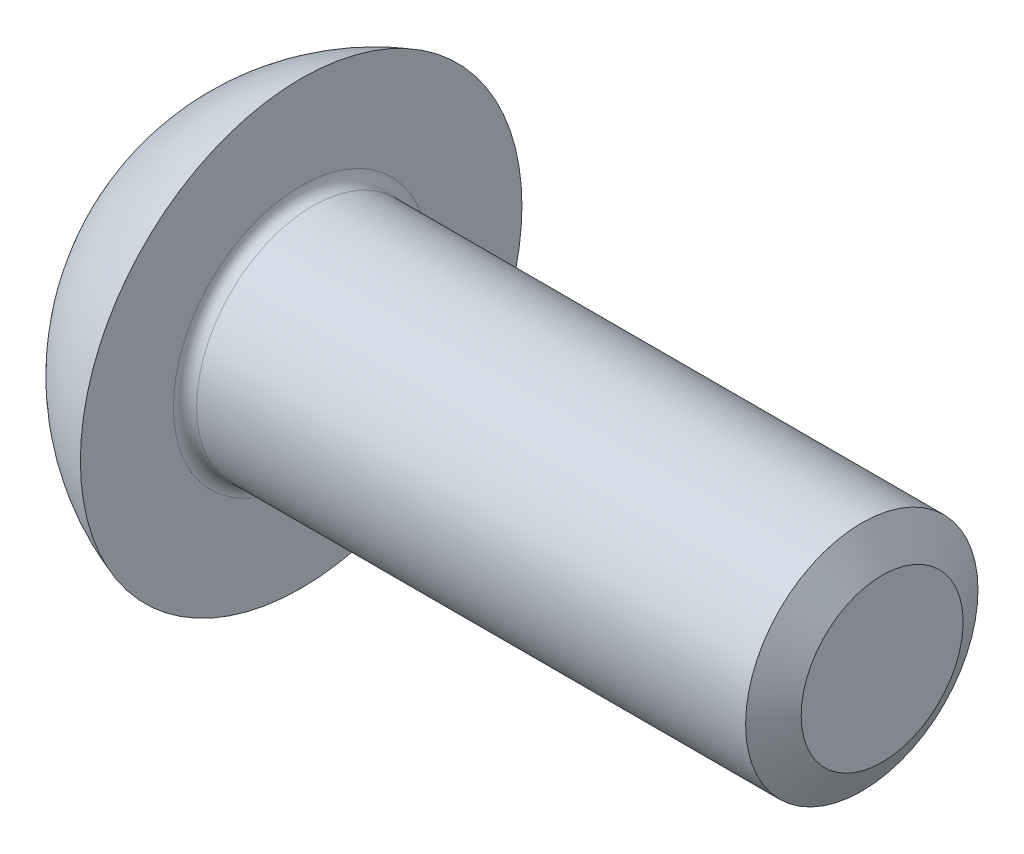
ISO-10303-21;
HEADER;
FILE_DESCRIPTION(('STEP AP214'),'2;1');
FILE_NAME('part.step','',(''),(''),'','','');
FILE_SCHEMA(('AUTOMOTIVE_DESIGN { 1 0 10303 214 1 1 1 1 }'));
ENDSEC;
DATA;
#1=APPLICATION_CONTEXT('core data for automotive mechanical design processes');
#2=APPLICATION_PROTOCOL_DEFINITION('international standard','automotive_design',2000,#1);
#3=PRODUCT_CONTEXT('',#1,'mechanical');
#4=PRODUCT('Part','Part','',(#3));
#5=PRODUCT_RELATED_PRODUCT_CATEGORY('part','',(#4));
#6=PRODUCT_DEFINITION_FORMATION('','',#4);
#7=PRODUCT_DEFINITION_CONTEXT('part definition',#1,'design');
#8=PRODUCT_DEFINITION('design','',#6,#7);
#9=PRODUCT_DEFINITION_SHAPE('','',#8);
#10=(LENGTH_UNIT() NAMED_UNIT(*) SI_UNIT(.MILLI.,.METRE.));
#11=(NAMED_UNIT(*) PLANE_ANGLE_UNIT() SI_UNIT($,.RADIAN.));
#12=(NAMED_UNIT(*) SI_UNIT($,.STERADIAN.) SOLID_ANGLE_UNIT());
#13=UNCERTAINTY_MEASURE_WITH_UNIT(LENGTH_MEASURE(1.E-05),#10,'distance_accuracy_value','');
#14=(GEOMETRIC_REPRESENTATION_CONTEXT(3) GLOBAL_UNCERTAINTY_ASSIGNED_CONTEXT((#13)) GLOBAL_UNIT_ASSIGNED_CONTEXT((#10,
#11,#12)) REPRESENTATION_CONTEXT('',''));
#15=CARTESIAN_POINT('',(0.,0.,0.));
#16=DIRECTION('',(0.,0.,1.));
#17=DIRECTION('',(1.,0.,0.));
#18=AXIS2_PLACEMENT_3D('',#15,#16,#17);
#19=CARTESIAN_POINT('',(-12.2,0.,0.));
#20=DIRECTION('',(-1.,0.,0.));
#21=DIRECTION('',(0.,0.,1.));
#22=AXIS2_PLACEMENT_3D('',#19,#20,#21);
#23=CYLINDRICAL_SURFACE('',#22,2.);
#24=CARTESIAN_POINT('',(-9.8,0.,0.));
#25=DIRECTION('',(-1.,0.,0.));
#26=DIRECTION('',(0.,0.,1.));
#27=AXIS2_PLACEMENT_3D('',#24,#25,#26);
#28=CIRCLE('',#27,2.);
#29=CARTESIAN_POINT('',(-9.8,0.,2.));
#30=VERTEX_POINT('',#29);
#31=EDGE_CURVE('E264',#30,#30,#28,.T.);
#32=ORIENTED_EDGE('',*,*,#31,.F.);
#33=EDGE_LOOP('',(#32));
#34=FACE_BOUND('',#33,.T.);
#35=CARTESIAN_POINT('',(-0.35,0.,0.));
#36=DIRECTION('',(-1.,0.,0.));
#37=DIRECTION('',(0.,0.,1.));
#38=AXIS2_PLACEMENT_3D('',#35,#36,#37);
#39=CIRCLE('',#38,2.);
#40=CARTESIAN_POINT('',(-0.35,0.,2.));
#41=VERTEX_POINT('',#40);
#42=EDGE_CURVE('E448',#41,#41,#39,.T.);
#43=ORIENTED_EDGE('',*,*,#42,.T.);
#44=EDGE_LOOP('',(#43));
#45=FACE_BOUND('',#44,.T.);
#46=ADVANCED_FACE('F42',(#34,#45),#23,.T.);
#47=CARTESIAN_POINT('',(-12.2,0.,0.));
#48=DIRECTION('',(1.,0.,0.));
#49=DIRECTION('',(0.,0.,-1.));
#50=AXIS2_PLACEMENT_3D('',#47,#48,#49);
#51=PLANE('',#50);
#52=CARTESIAN_POINT('',(-12.2,0.,0.));
#53=DIRECTION('',(-1.,0.,0.));
#54=DIRECTION('',(0.,0.,1.));
#55=AXIS2_PLACEMENT_3D('',#52,#53,#54);
#56=CIRCLE('',#55,2.);
#57=CARTESIAN_POINT('',(-12.2,2.,0.));
#58=VERTEX_POINT('',#57);
#59=EDGE_CURVE('E256',#58,#58,#56,.T.);
#60=ORIENTED_EDGE('',*,*,#59,.T.);
#61=EDGE_LOOP('',(#60));
#62=FACE_BOUND('',#61,.T.);
#63=CARTESIAN_POINT('',(-12.2,0.,0.));
#64=DIRECTION('',(1.,0.,0.));
#65=DIRECTION('',(0.,0.,-1.));
#66=AXIS2_PLACEMENT_3D('',#63,#64,#65);
#67=CIRCLE('',#66,1.44337567297406);
#68=CARTESIAN_POINT('',(-12.2,-0.721687836487032,-1.25));
#69=VERTEX_POINT('',#68);
#70=CARTESIAN_POINT('',(-12.2,-1.44337567297406,0.));
#71=VERTEX_POINT('',#70);
#72=EDGE_CURVE('E11',#69,#71,#67,.F.);
#73=ORIENTED_EDGE('',*,*,#72,.F.);
#74=CARTESIAN_POINT('',(-12.2,0.721687836487032,-1.25));
#75=VERTEX_POINT('',#74);
#76=EDGE_CURVE('E46',#75,#69,#67,.F.);
#77=ORIENTED_EDGE('',*,*,#76,.F.);
#78=CARTESIAN_POINT('',(-12.2,1.44337567297406,0.));
#79=VERTEX_POINT('',#78);
#80=EDGE_CURVE('E115',#79,#75,#67,.F.);
#81=ORIENTED_EDGE('',*,*,#80,.F.);
#82=CARTESIAN_POINT('',(-12.2,0.721687836487032,1.25));
#83=VERTEX_POINT('',#82);
#84=EDGE_CURVE('E329',#83,#79,#67,.F.);
#85=ORIENTED_EDGE('',*,*,#84,.F.);
#86=CARTESIAN_POINT('',(-12.2,-0.721687836487031,1.25));
#87=VERTEX_POINT('',#86);
#88=EDGE_CURVE('E51',#87,#83,#67,.F.);
#89=ORIENTED_EDGE('',*,*,#88,.F.);
#90=CARTESIAN_POINT('',(-12.2,0.,0.));
#91=DIRECTION('',(-1.,0.,0.));
#92=DIRECTION('',(0.,-1.,0.));
#93=AXIS2_PLACEMENT_3D('',#90,#91,#92);
#94=CIRCLE('',#93,1.44337567297406);
#95=EDGE_CURVE('E118',#71,#87,#94,.T.);
#96=ORIENTED_EDGE('',*,*,#95,.F.);
#97=EDGE_LOOP('',(#73,#77,#81,#85,#89,#96));
#98=FACE_BOUND('',#97,.T.);
#99=ADVANCED_FACE('F44',(#62,#98),#51,.F.);
#100=CARTESIAN_POINT('',(-8.72727272727273,0.,0.));
#101=DIRECTION('',(-1.,0.,0.));
#102=DIRECTION('',(0.,1.,0.));
#103=AXIS2_PLACEMENT_3D('',#100,#101,#102);
#104=SPHERICAL_SURFACE('',#103,4.00747235932374);
#105=CARTESIAN_POINT('',(-10.,0.,0.));
#106=DIRECTION('',(-1.,0.,0.));
#107=DIRECTION('',(0.,0.,1.));
#108=AXIS2_PLACEMENT_3D('',#105,#106,#107);
#109=CIRCLE('',#108,3.8);
#110=CARTESIAN_POINT('',(-10.,3.8,0.));
#111=VERTEX_POINT('',#110);
#112=EDGE_CURVE('E259',#111,#111,#109,.T.);
#113=CARTESIAN_POINT('',(-12.2,2.,0.));
#114=CARTESIAN_POINT('',(-12.1848940441993,2.0262295590073,0.));
#115=CARTESIAN_POINT('',(-12.1694908144314,2.05228791024858,0.));
#116=CARTESIAN_POINT('',(-12.1380979525594,2.10404896261472,0.));
#117=CARTESIAN_POINT('',(-12.1221083204554,2.12975166373958,0.));
#118=CARTESIAN_POINT('',(-12.0895507995097,2.18078818128854,0.));
#119=CARTESIAN_POINT('',(-12.072982910668,2.20612199771262,0.));
#120=CARTESIAN_POINT('',(-12.0392773993975,2.25640774959029,0.));
#121=CARTESIAN_POINT('',(-12.0221397769687,2.28135968504386,0.));
#122=CARTESIAN_POINT('',(-11.9873035925655,2.33086886166223,0.));
#123=CARTESIAN_POINT('',(-11.9696050305911,2.35542610282703,0.));
#124=CARTESIAN_POINT('',(-11.9336560549214,2.40413328370188,0.));
#125=CARTESIAN_POINT('',(-11.9154056412261,2.42828322341193,0.));
#126=CARTESIAN_POINT('',(-11.8783623317131,2.47616340238235,0.));
#127=CARTESIAN_POINT('',(-11.8595694358953,2.49989364164271,0.));
#128=CARTESIAN_POINT('',(-11.8214508106667,2.54692223644896,0.));
#129=CARTESIAN_POINT('',(-11.8021250812559,2.57022059199485,0.));
#130=CARTESIAN_POINT('',(-11.7629507108208,2.61637345777279,0.));
#131=CARTESIAN_POINT('',(-11.7431020697966,2.63922796800483,0.));
#132=CARTESIAN_POINT('',(-11.7028920666117,2.68448140944799,0.));
#133=CARTESIAN_POINT('',(-11.682530704451,2.70688034065911,0.));
#134=CARTESIAN_POINT('',(-11.6413057126977,2.75121112424681,0.));
#135=CARTESIAN_POINT('',(-11.6204420831052,2.77314297662341,0.));
#136=CARTESIAN_POINT('',(-11.5782232680636,2.81652834253228,0.));
#137=CARTESIAN_POINT('',(-11.5568680826145,2.83798185606455,0.));
#138=CARTESIAN_POINT('',(-11.5136771198039,2.88039952985806,0.));
#139=CARTESIAN_POINT('',(-11.4918413424423,2.90136369011931,0.));
#140=CARTESIAN_POINT('',(-11.447700406491,2.94279189418253,0.));
#141=CARTESIAN_POINT('',(-11.4253952479013,2.96325593798452,0.));
#142=CARTESIAN_POINT('',(-11.3803270011625,3.00367340270524,0.));
#143=CARTESIAN_POINT('',(-11.3575639130134,3.02362682362398,0.));
#144=CARTESIAN_POINT('',(-11.3115914939299,3.06301279831263,0.));
#145=CARTESIAN_POINT('',(-11.2883821629955,3.08244535208254,0.));
#146=CARTESIAN_POINT('',(-11.2415291742204,3.12077961562579,0.));
#147=CARTESIAN_POINT('',(-11.2178855163797,3.13968132539914,0.));
#148=CARTESIAN_POINT('',(-11.1701760126585,3.17694419664163,0.));
#149=CARTESIAN_POINT('',(-11.1461101667779,3.19530535811077,0.));
#150=CARTESIAN_POINT('',(-11.0975686425984,3.23147770595957,0.));
#151=CARTESIAN_POINT('',(-11.0730929642995,3.24928889233922,0.));
#152=CARTESIAN_POINT('',(-11.0237443413165,3.2843521455859,0.));
#153=CARTESIAN_POINT('',(-10.9988713966324,3.30160421245294,0.));
#154=CARTESIAN_POINT('',(-10.9487410108723,3.3355403693082,0.));
#155=CARTESIAN_POINT('',(-10.9234835697963,3.35222445929642,0.));
#156=CARTESIAN_POINT('',(-10.8725971586496,3.38501609663248,0.));
#157=CARTESIAN_POINT('',(-10.846968188579,3.40112364398032,0.));
#158=CARTESIAN_POINT('',(-10.7953518775865,3.43275392627554,0.));
#159=CARTESIAN_POINT('',(-10.7693645366645,3.44827666122294,0.));
#160=CARTESIAN_POINT('',(-10.7170448261044,3.47872934920754,0.));
#161=CARTESIAN_POINT('',(-10.6907124564662,3.49365930224475,0.));
#162=CARTESIAN_POINT('',(-10.6377162077463,3.52291876123,0.));
#163=CARTESIAN_POINT('',(-10.6110523286645,3.53724826717803,0.));
#164=CARTESIAN_POINT('',(-10.5574067505418,3.56529947511373,0.));
#165=CARTESIAN_POINT('',(-10.5304250515009,3.57902117710138,0.));
#166=CARTESIAN_POINT('',(-10.4761576860719,3.60584973217452,0.));
#167=CARTESIAN_POINT('',(-10.4488720196837,3.61895658526,0.));
#168=CARTESIAN_POINT('',(-10.3940107283966,3.6445487137135,0.));
#169=CARTESIAN_POINT('',(-10.3664351034975,3.65703398908152,0.));
#170=CARTESIAN_POINT('',(-10.3110080522769,3.6813765507008,0.));
#171=CARTESIAN_POINT('',(-10.2831566259553,3.69323383695206,0.));
#172=CARTESIAN_POINT('',(-10.2271922728732,3.71631433772655,0.));
#173=CARTESIAN_POINT('',(-10.1990793461126,3.72753755224977,0.));
#174=CARTESIAN_POINT('',(-10.1426064188229,3.74934412871163,0.));
#175=CARTESIAN_POINT('',(-10.1142464182938,3.75992749065027,0.));
#176=CARTESIAN_POINT('',(-10.0572939289701,3.78044899835327,0.));
#177=CARTESIAN_POINT('',(-10.0287014401756,3.79038714411763,0.));
#178=CARTESIAN_POINT('',(-10.,3.8,0.));
#179=B_SPLINE_CURVE_WITH_KNOTS('',3,(#113,#114,#115,#116,#117,#118,#119,#120,#121,#122,#123,
#124,#125,#126,#127,#128,#129,#130,#131,#132,#133,#134,#135,#136,#137,#138,#139,#140,#141,#142,
#143,#144,#145,#146,#147,#148,#149,#150,#151,#152,#153,#154,#155,#156,#157,#158,#159,#160,#161,
#162,#163,#164,#165,#166,#167,#168,#169,#170,#171,#172,#173,#174,#175,#176,#177,#178),
.UNSPECIFIED.,.F.,.F.,(4,2,2,2,2,2,2,2,2,2,2,2,2,2,2,2,2,2,2,2,2,2,2,2,2,2,2,2,2,2,2,2,4),(0.,
0.0908034330338798,0.18160686606776,0.272410299101639,0.363213732135517,0.454017165169397,
0.544820598203277,0.635624031237157,0.726427464271036,0.817230897304916,0.908034330338795,
0.998837763372675,1.08964119640655,1.18044462944043,1.27124806247431,1.36205149550819,
1.45285492854207,1.54365836157595,1.63446179460983,1.72526522764371,1.81606866067759,
1.90687209371147,1.99767552674535,2.08847895977923,2.17928239281311,2.27008582584699,
2.36088925888087,2.45169269191475,2.54249612494863,2.63329955798251,2.72410299101639,
2.81490642405026,2.90570985708414),.UNSPECIFIED.);
#180=EDGE_CURVE('BSEAM244',#58,#111,#179,.T.);
#181=ORIENTED_EDGE('',*,*,#59,.F.);
#182=ORIENTED_EDGE('',*,*,#112,.T.);
#183=ORIENTED_EDGE('',*,*,#180,.T.);
#184=ORIENTED_EDGE('',*,*,#180,.F.);
#185=EDGE_LOOP('',(#181,#183,#182,#184));
#186=FACE_BOUND('',#185,.T.);
#187=ADVANCED_FACE('F244',(#186),#104,.T.);
#188=CARTESIAN_POINT('',(-10.,2.2,0.));
#189=DIRECTION('',(-1.,0.,0.));
#190=DIRECTION('',(0.,0.,1.));
#191=AXIS2_PLACEMENT_3D('',#188,#189,#190);
#192=PLANE('',#191);
#193=ORIENTED_EDGE('',*,*,#112,.F.);
#194=EDGE_LOOP('',(#193));
#195=FACE_BOUND('',#194,.T.);
#196=CARTESIAN_POINT('',(-10.,0.,0.));
#197=DIRECTION('',(-1.,0.,0.));
#198=DIRECTION('',(0.,0.,1.));
#199=AXIS2_PLACEMENT_3D('',#196,#197,#198);
#200=CIRCLE('',#199,2.2);
#201=CARTESIAN_POINT('',(-10.,0.,2.2));
#202=VERTEX_POINT('',#201);
#203=EDGE_CURVE('E260',#202,#202,#200,.T.);
#204=ORIENTED_EDGE('',*,*,#203,.T.);
#205=EDGE_LOOP('',(#204));
#206=FACE_BOUND('',#205,.T.);
#207=ADVANCED_FACE('F241',(#195,#206),#192,.F.);
#208=CARTESIAN_POINT('',(-9.8,0.,0.));
#209=DIRECTION('',(-1.,0.,0.));
#210=DIRECTION('',(0.,0.,1.));
#211=AXIS2_PLACEMENT_3D('',#208,#209,#210);
#212=TOROIDAL_SURFACE('',#211,2.2,0.200000000000001);
#213=ORIENTED_EDGE('',*,*,#203,.F.);
#214=EDGE_LOOP('',(#213));
#215=FACE_BOUND('',#214,.T.);
#216=ORIENTED_EDGE('',*,*,#31,.T.);
#217=EDGE_LOOP('',(#216));
#218=FACE_BOUND('',#217,.T.);
#219=ADVANCED_FACE('F238',(#215,#218),#212,.F.);
#220=CARTESIAN_POINT('',(-11.83,0.,0.));
#221=DIRECTION('',(-1.,0.,0.));
#222=DIRECTION('',(0.,-1.,0.));
#223=AXIS2_PLACEMENT_3D('',#220,#221,#222);
#224=CONICAL_SURFACE('',#223,0.,1.31985626102756);
#225=CARTESIAN_POINT('',(-12.4099346759325,-1.885644561076,-1.25));
#226=CARTESIAN_POINT('',(-12.3978717207476,-1.8291770874165,-1.25));
#227=CARTESIAN_POINT('',(-12.3859628503841,-1.7726766725723,-1.25));
#228=CARTESIAN_POINT('',(-12.3625309817374,-1.65959353753871,-1.25));
#229=CARTESIAN_POINT('',(-12.3510079994509,-1.60301081403847,-1.25));
#230=CARTESIAN_POINT('',(-12.3171150455956,-1.43301680255399,-1.25));
#231=CARTESIAN_POINT('',(-12.2954436732229,-1.31946408423816,-1.25));
#232=CARTESIAN_POINT('',(-12.2550957638519,-1.09274070822473,-1.25));
#233=CARTESIAN_POINT('',(-12.2363969731627,-0.97957409090879,-1.25));
#234=CARTESIAN_POINT('',(-12.2032623365578,-0.752620098767597,-1.25));
#235=CARTESIAN_POINT('',(-12.188825705465,-0.638832842215426,-1.25));
#236=CARTESIAN_POINT('',(-12.1660896767959,-0.409425109570646,-1.25));
#237=CARTESIAN_POINT('',(-12.1578544497063,-0.293797778292055,-1.25));
#238=CARTESIAN_POINT('',(-12.1515679025376,-0.12016451287169,-1.25));
#239=CARTESIAN_POINT('',(-12.150483164521,-0.0622627928697091,-1.25));
#240=CARTESIAN_POINT('',(-12.1503795328621,0.0535425643634299,-1.25));
#241=CARTESIAN_POINT('',(-12.1513606413601,0.111446201596512,-1.25));
#242=CARTESIAN_POINT('',(-12.1573598650309,0.28547429561123,-1.25));
#243=CARTESIAN_POINT('',(-12.1654487463646,0.401498867331898,-1.25));
#244=CARTESIAN_POINT('',(-12.1881044285101,0.632939913567424,-1.25));
#245=CARTESIAN_POINT('',(-12.2026754362751,0.748355943831217,-1.25));
#246=CARTESIAN_POINT('',(-12.2365518645336,0.980878548339567,-1.25));
#247=CARTESIAN_POINT('',(-12.2559479393881,1.09797147869704,-1.25));
#248=CARTESIAN_POINT('',(-12.297694705209,1.33163516353436,-1.25));
#249=CARTESIAN_POINT('',(-12.3200458280349,1.44820583911092,-1.25));
#250=CARTESIAN_POINT('',(-12.3666691464558,1.68099121637416,-1.25));
#251=CARTESIAN_POINT('',(-12.3909418646374,1.79720581223611,-1.25));
#252=CARTESIAN_POINT('',(-12.4407644332086,2.02936144854685,-1.25));
#253=CARTESIAN_POINT('',(-12.4663143094331,2.14530248341221,-1.25));
#254=CARTESIAN_POINT('',(-12.518006571917,2.37571314631909,-1.25));
#255=CARTESIAN_POINT('',(-12.5441393559518,2.49018493743663,-1.25));
#256=CARTESIAN_POINT('',(-12.5970181249123,2.71898894131966,-1.25));
#257=CARTESIAN_POINT('',(-12.6237641225282,2.83332115114489,-1.25));
#258=CARTESIAN_POINT('',(-12.6776683130688,3.06173187864781,-1.25));
#259=CARTESIAN_POINT('',(-12.7048259274931,3.17581053313172,-1.25));
#260=CARTESIAN_POINT('',(-12.7594820608418,3.40388218743046,-1.25));
#261=CARTESIAN_POINT('',(-12.7869805683896,3.51787518996983,-1.25));
#262=CARTESIAN_POINT('',(-12.8145979060137,3.63183906574753,-1.25));
#263=B_SPLINE_CURVE_WITH_KNOTS('',3,(#225,#226,#227,#228,#229,#230,#231,#232,#233,#234,#235,
#236,#237,#238,#239,#240,#241,#242,#243,#244,#245,#246,#247,#248,#249,#250,#251,#252,#253,#254,
#255,#256,#257,#258,#259,#260,#261,#262),.UNSPECIFIED.,.F.,.F.,(4,2,2,2,2,2,2,2,2,2,2,2,2,2,2,2,
2,2,4),(0.,0.173224298995285,0.346455770019722,0.693239171189212,1.03728991141696,
1.38127723083866,1.72877689604067,1.90247833739644,2.07617995870963,2.42483219738436,
2.77371104508349,3.12971850144866,3.48577804345035,3.84193475233927,4.19809866864178,
4.55034691705482,4.90260246171338,5.25440194240088,5.60618971383707),.UNSPECIFIED.);
#264=EDGE_CURVE('E106',#69,#75,#263,.T.);
#265=ORIENTED_EDGE('',*,*,#264,.T.);
#266=ORIENTED_EDGE('',*,*,#76,.T.);
#267=EDGE_LOOP('',(#265,#266));
#268=FACE_BOUND('',#267,.T.);
#269=ADVANCED_FACE('F110',(#268),#224,.F.);
#270=CARTESIAN_POINT('',(-12.2000296035517,0.721572366433194,-1.2502));
#271=CARTESIAN_POINT('',(-12.1923376245114,0.751560236122211,-1.19825948608787));
#272=CARTESIAN_POINT('',(-12.1853558988612,0.781597955311093,-1.14623263030924));
#273=CARTESIAN_POINT('',(-12.1730912390252,0.841770545746215,-1.04201064645257));
#274=CARTESIAN_POINT('',(-12.1678089341386,0.871905448817342,-0.989815463252219));
#275=CARTESIAN_POINT('',(-12.1592477971586,0.932104975245319,-0.885546824887377));
#276=CARTESIAN_POINT('',(-12.1559596086559,0.96216925702196,-0.833473961357168));
#277=CARTESIAN_POINT('',(-12.1515506008694,1.0223329488635,-0.729267390316703));
#278=CARTESIAN_POINT('',(-12.1504293994002,1.05243235179702,-0.677133695158352));
#279=CARTESIAN_POINT('',(-12.1504293994002,1.11263115766407,-0.572866304841649));
#280=CARTESIAN_POINT('',(-12.1515506008694,1.1427305605976,-0.520732609683297));
#281=CARTESIAN_POINT('',(-12.1559596086559,1.20289425243914,-0.416526038642832));
#282=CARTESIAN_POINT('',(-12.1592477971586,1.23295853421578,-0.364453175112624));
#283=CARTESIAN_POINT('',(-12.1678089341386,1.29315806064375,-0.260184536747781));
#284=CARTESIAN_POINT('',(-12.1730912390252,1.32329296371488,-0.207989353547427));
#285=CARTESIAN_POINT('',(-12.1853558988612,1.38346555415,-0.103767369690763));
#286=CARTESIAN_POINT('',(-12.1923376245114,1.41350327333889,-0.0517405139121316));
#287=CARTESIAN_POINT('',(-12.2000296035517,1.4434911430279,0.000199999999999756));
#288=B_SPLINE_CURVE_WITH_KNOTS('',3,(#270,#271,#272,#273,#274,#275,#276,#277,#278,#279,#280,
#281,#282,#283,#284,#285,#286,#287),.UNSPECIFIED.,.F.,.F.,(4,2,2,2,2,2,2,2,4),(0.,
0.181409592460798,0.362886284169927,0.543504761741732,0.724091381228726,0.904678000715721,
1.08529647828753,1.26677316999666,1.44818276245745),.UNSPECIFIED.);
#289=EDGE_CURVE('E134',#75,#79,#288,.T.);
#290=ORIENTED_EDGE('',*,*,#289,.T.);
#291=ORIENTED_EDGE('',*,*,#80,.T.);
#292=EDGE_LOOP('',(#290,#291));
#293=FACE_BOUND('',#292,.T.);
#294=ADVANCED_FACE('F162',(#293),#224,.F.);
#295=CARTESIAN_POINT('',(-12.2000296035517,1.4434911430279,-0.000200000000000031));
#296=CARTESIAN_POINT('',(-12.1923376245114,1.41350327333889,0.0517405139121313));
#297=CARTESIAN_POINT('',(-12.1853558988612,1.38346555415,0.103767369690762));
#298=CARTESIAN_POINT('',(-12.1730912390252,1.32329296371488,0.207989353547427));
#299=CARTESIAN_POINT('',(-12.1678089341386,1.29315806064375,0.260184536747781));
#300=CARTESIAN_POINT('',(-12.1592477971586,1.23295853421578,0.364453175112623));
#301=CARTESIAN_POINT('',(-12.1559596086559,1.20289425243914,0.416526038642832));
#302=CARTESIAN_POINT('',(-12.1515506008694,1.1427305605976,0.520732609683297));
#303=CARTESIAN_POINT('',(-12.1504293994002,1.11263115766407,0.572866304841648));
#304=CARTESIAN_POINT('',(-12.1504293994002,1.05243235179702,0.677133695158351));
#305=CARTESIAN_POINT('',(-12.1515506008694,1.0223329488635,0.729267390316703));
#306=CARTESIAN_POINT('',(-12.1559596086559,0.96216925702196,0.833473961357168));
#307=CARTESIAN_POINT('',(-12.1592477971586,0.93210497524532,0.885546824887376));
#308=CARTESIAN_POINT('',(-12.1678089341386,0.871905448817342,0.989815463252219));
#309=CARTESIAN_POINT('',(-12.1730912390252,0.841770545746216,1.04201064645257));
#310=CARTESIAN_POINT('',(-12.1853558988612,0.781597955311094,1.14623263030924));
#311=CARTESIAN_POINT('',(-12.1923376245114,0.751560236122211,1.19825948608787));
#312=CARTESIAN_POINT('',(-12.2000296035517,0.721572366433195,1.2502));
#313=B_SPLINE_CURVE_WITH_KNOTS('',3,(#295,#296,#297,#298,#299,#300,#301,#302,#303,#304,#305,
#306,#307,#308,#309,#310,#311,#312),.UNSPECIFIED.,.F.,.F.,(4,2,2,2,2,2,2,2,4),(0.,
0.181409592460797,0.362886284169926,0.543504761741732,0.724091381228726,0.904678000715721,
1.08529647828753,1.26677316999665,1.44818276245745),.UNSPECIFIED.);
#314=EDGE_CURVE('E184',#79,#83,#313,.T.);
#315=ORIENTED_EDGE('',*,*,#314,.T.);
#316=ORIENTED_EDGE('',*,*,#84,.T.);
#317=EDGE_LOOP('',(#315,#316));
#318=FACE_BOUND('',#317,.T.);
#319=ADVANCED_FACE('F156',(#318),#224,.F.);
#320=CARTESIAN_POINT('',(-12.4099346759325,-1.885644561076,1.25));
#321=CARTESIAN_POINT('',(-12.3978717207476,-1.8291770874165,1.25));
#322=CARTESIAN_POINT('',(-12.3859628503841,-1.7726766725723,1.25));
#323=CARTESIAN_POINT('',(-12.3625309817374,-1.65959353753871,1.25));
#324=CARTESIAN_POINT('',(-12.3510079994509,-1.60301081403847,1.25));
#325=CARTESIAN_POINT('',(-12.3171150455956,-1.43301680255399,1.25));
#326=CARTESIAN_POINT('',(-12.2954436732229,-1.31946408423817,1.25));
#327=CARTESIAN_POINT('',(-12.2550957638519,-1.09274070822473,1.25));
#328=CARTESIAN_POINT('',(-12.2363969731627,-0.97957409090879,1.25));
#329=CARTESIAN_POINT('',(-12.2032623365578,-0.752620098767597,1.25));
#330=CARTESIAN_POINT('',(-12.188825705465,-0.638832842215426,1.25));
#331=CARTESIAN_POINT('',(-12.1660896767959,-0.409425109570646,1.25));
#332=CARTESIAN_POINT('',(-12.1578544497063,-0.293797778292056,1.25));
#333=CARTESIAN_POINT('',(-12.1515679025376,-0.120164512871691,1.25));
#334=CARTESIAN_POINT('',(-12.150483164521,-0.0622627928697096,1.25));
#335=CARTESIAN_POINT('',(-12.1503795328621,0.0535425643634294,1.25));
#336=CARTESIAN_POINT('',(-12.1513606413601,0.111446201596511,1.25));
#337=CARTESIAN_POINT('',(-12.1573598650309,0.285474295611229,1.25));
#338=CARTESIAN_POINT('',(-12.1654487463646,0.401498867331898,1.25));
#339=CARTESIAN_POINT('',(-12.1881044285101,0.632939913567424,1.25));
#340=CARTESIAN_POINT('',(-12.2026754362751,0.748355943831216,1.25));
#341=CARTESIAN_POINT('',(-12.2365518645336,0.980878548339567,1.25));
#342=CARTESIAN_POINT('',(-12.2559479393881,1.09797147869704,1.25));
#343=CARTESIAN_POINT('',(-12.297694705209,1.33163516353436,1.25));
#344=CARTESIAN_POINT('',(-12.3200458280349,1.44820583911092,1.25));
#345=CARTESIAN_POINT('',(-12.3666691464558,1.68099121637416,1.25));
#346=CARTESIAN_POINT('',(-12.3909418646374,1.79720581223611,1.25));
#347=CARTESIAN_POINT('',(-12.4407644332086,2.02936144854685,1.25));
#348=CARTESIAN_POINT('',(-12.4663143094331,2.14530248341221,1.25));
#349=CARTESIAN_POINT('',(-12.518006571917,2.37571314631909,1.25));
#350=CARTESIAN_POINT('',(-12.5441393559518,2.49018493743663,1.25));
#351=CARTESIAN_POINT('',(-12.5970181249123,2.71898894131966,1.25));
#352=CARTESIAN_POINT('',(-12.6237641225282,2.83332115114489,1.25));
#353=CARTESIAN_POINT('',(-12.6776683130688,3.06173187864781,1.25));
#354=CARTESIAN_POINT('',(-12.7048259274931,3.17581053313172,1.25));
#355=CARTESIAN_POINT('',(-12.7594820608418,3.40388218743046,1.25));
#356=CARTESIAN_POINT('',(-12.7869805683896,3.51787518996983,1.25));
#357=CARTESIAN_POINT('',(-12.8145979060137,3.63183906574753,1.25));
#358=B_SPLINE_CURVE_WITH_KNOTS('',3,(#320,#321,#322,#323,#324,#325,#326,#327,#328,#329,#330,
#331,#332,#333,#334,#335,#336,#337,#338,#339,#340,#341,#342,#343,#344,#345,#346,#347,#348,#349,
#350,#351,#352,#353,#354,#355,#356,#357),.UNSPECIFIED.,.F.,.F.,(4,2,2,2,2,2,2,2,2,2,2,2,2,2,2,2,
2,2,4),(0.,0.173224298995285,0.346455770019722,0.693239171189212,1.03728991141696,
1.38127723083866,1.72877689604067,1.90247833739644,2.07617995870963,2.42483219738436,
2.77371104508349,3.12971850144866,3.48577804345035,3.84193475233927,4.19809866864178,
4.55034691705482,4.90260246171338,5.25440194240088,5.60618971383707),.UNSPECIFIED.);
#359=EDGE_CURVE('E63',#83,#87,#358,.F.);
#360=ORIENTED_EDGE('',*,*,#359,.T.);
#361=ORIENTED_EDGE('',*,*,#88,.T.);
#362=EDGE_LOOP('',(#360,#361));
#363=FACE_BOUND('',#362,.T.);
#364=ADVANCED_FACE('F161',(#363),#224,.F.);
#365=CARTESIAN_POINT('',(-12.2000296035517,-0.721572366433195,1.2502));
#366=CARTESIAN_POINT('',(-12.1923376245114,-0.751560236122212,1.19825948608787));
#367=CARTESIAN_POINT('',(-12.1853558988612,-0.781597955311094,1.14623263030924));
#368=CARTESIAN_POINT('',(-12.1730912390252,-0.841770545746216,1.04201064645257));
#369=CARTESIAN_POINT('',(-12.1678089341386,-0.871905448817343,0.989815463252219));
#370=CARTESIAN_POINT('',(-12.1592477971586,-0.93210497524532,0.885546824887376));
#371=CARTESIAN_POINT('',(-12.1559596086559,-0.962169257021961,0.833473961357168));
#372=CARTESIAN_POINT('',(-12.1515506008694,-1.0223329488635,0.729267390316703));
#373=CARTESIAN_POINT('',(-12.1504293994002,-1.05243235179702,0.677133695158351));
#374=CARTESIAN_POINT('',(-12.1504293994002,-1.11263115766407,0.572866304841648));
#375=CARTESIAN_POINT('',(-12.1515506008694,-1.1427305605976,0.520732609683297));
#376=CARTESIAN_POINT('',(-12.1559596086559,-1.20289425243914,0.416526038642831));
#377=CARTESIAN_POINT('',(-12.1592477971586,-1.23295853421578,0.364453175112623));
#378=CARTESIAN_POINT('',(-12.1678089341386,-1.29315806064376,0.260184536747781));
#379=CARTESIAN_POINT('',(-12.1730912390252,-1.32329296371488,0.207989353547427));
#380=CARTESIAN_POINT('',(-12.1853558988612,-1.38346555415,0.103767369690762));
#381=CARTESIAN_POINT('',(-12.1923376245114,-1.41350327333889,0.0517405139121309));
#382=CARTESIAN_POINT('',(-12.2000296035517,-1.4434911430279,-0.000200000000000191));
#383=B_SPLINE_CURVE_WITH_KNOTS('',3,(#365,#366,#367,#368,#369,#370,#371,#372,#373,#374,#375,
#376,#377,#378,#379,#380,#381,#382),.UNSPECIFIED.,.F.,.F.,(4,2,2,2,2,2,2,2,4),(0.,
0.181409592460797,0.362886284169926,0.543504761741732,0.724091381228726,0.904678000715721,
1.08529647828753,1.26677316999666,1.44818276245745),.UNSPECIFIED.);
#384=EDGE_CURVE('E57',#87,#71,#383,.T.);
#385=ORIENTED_EDGE('',*,*,#384,.T.);
#386=ORIENTED_EDGE('',*,*,#95,.T.);
#387=EDGE_LOOP('',(#385,#386));
#388=FACE_BOUND('',#387,.T.);
#389=ADVANCED_FACE('F316',(#388),#224,.F.);
#390=CARTESIAN_POINT('',(-12.2000296035517,-1.4434911430279,0.000199999999999413));
#391=CARTESIAN_POINT('',(-12.1923376245114,-1.41350327333889,-0.0517405139121317));
#392=CARTESIAN_POINT('',(-12.1853558988612,-1.38346555415,-0.103767369690763));
#393=CARTESIAN_POINT('',(-12.1730912390252,-1.32329296371488,-0.207989353547427));
#394=CARTESIAN_POINT('',(-12.1678089341386,-1.29315806064376,-0.260184536747781));
#395=CARTESIAN_POINT('',(-12.1592477971586,-1.23295853421578,-0.364453175112624));
#396=CARTESIAN_POINT('',(-12.1559596086559,-1.20289425243914,-0.416526038642832));
#397=CARTESIAN_POINT('',(-12.1515506008694,-1.1427305605976,-0.520732609683297));
#398=CARTESIAN_POINT('',(-12.1504293994002,-1.11263115766407,-0.572866304841649));
#399=CARTESIAN_POINT('',(-12.1504293994002,-1.05243235179702,-0.677133695158352));
#400=CARTESIAN_POINT('',(-12.1515506008694,-1.0223329488635,-0.729267390316703));
#401=CARTESIAN_POINT('',(-12.1559596086559,-0.96216925702196,-0.833473961357168));
#402=CARTESIAN_POINT('',(-12.1592477971586,-0.93210497524532,-0.885546824887376));
#403=CARTESIAN_POINT('',(-12.1678089341386,-0.871905448817343,-0.989815463252219));
#404=CARTESIAN_POINT('',(-12.1730912390252,-0.841770545746216,-1.04201064645257));
#405=CARTESIAN_POINT('',(-12.1853558988612,-0.781597955311094,-1.14623263030924));
#406=CARTESIAN_POINT('',(-12.1923376245114,-0.751560236122212,-1.19825948608787));
#407=CARTESIAN_POINT('',(-12.2000296035517,-0.721572366433195,-1.2502));
#408=B_SPLINE_CURVE_WITH_KNOTS('',3,(#390,#391,#392,#393,#394,#395,#396,#397,#398,#399,#400,
#401,#402,#403,#404,#405,#406,#407),.UNSPECIFIED.,.F.,.F.,(4,2,2,2,2,2,2,2,4),(0.,
0.181409592460797,0.362886284169926,0.543504761741732,0.724091381228726,0.904678000715721,
1.08529647828753,1.26677316999665,1.44818276245745),.UNSPECIFIED.);
#409=EDGE_CURVE('E98',#71,#69,#408,.T.);
#410=ORIENTED_EDGE('',*,*,#409,.T.);
#411=ORIENTED_EDGE('',*,*,#72,.T.);
#412=EDGE_LOOP('',(#410,#411));
#413=FACE_BOUND('',#412,.T.);
#414=ADVANCED_FACE('F100',(#413),#224,.F.);
#415=CARTESIAN_POINT('',(-10.9,0.,0.));
#416=DIRECTION('',(-1.,0.,0.));
#417=DIRECTION('',(0.,0.,1.));
#418=AXIS2_PLACEMENT_3D('',#415,#416,#417);
#419=CONICAL_SURFACE('',#418,1.44337567297406,1.01324881882863);
#420=CARTESIAN_POINT('',(-10.,0.,0.));
#421=VERTEX_POINT('',#420);
#422=VERTEX_LOOP('',#421);
#423=FACE_BOUND('',#422,.T.);
#424=CARTESIAN_POINT('',(-11.3527945795421,-1.77325319370587,1.25));
#425=CARTESIAN_POINT('',(-11.3272313608337,-1.72308054748254,1.25));
#426=CARTESIAN_POINT('',(-11.3019425610441,-1.67276579739611,1.25));
#427=CARTESIAN_POINT('',(-11.2520602884769,-1.57178113050657,1.25));
#428=CARTESIAN_POINT('',(-11.2274669508561,-1.52111114702254,1.25));
#429=CARTESIAN_POINT('',(-11.1789832389279,-1.41905106562435,1.25));
#430=CARTESIAN_POINT('',(-11.1550981267071,-1.36765845463947,1.25));
#431=CARTESIAN_POINT('',(-11.1084115654386,-1.26438731533743,1.25));
#432=CARTESIAN_POINT('',(-11.0856100580289,-1.21250881337054,1.25));
#433=CARTESIAN_POINT('',(-11.0180066296141,-1.05318865262781,1.25));
#434=CARTESIAN_POINT('',(-10.975348048821,-0.944818595736523,1.25));
#435=CARTESIAN_POINT('',(-10.899249765014,-0.725021793662277,1.25));
#436=CARTESIAN_POINT('',(-10.8657864364544,-0.61360370625827,1.25));
#437=CARTESIAN_POINT('',(-10.8255224000706,-0.439829475428556,1.25));
#438=CARTESIAN_POINT('',(-10.8135539759356,-0.378686784718628,1.25));
#439=CARTESIAN_POINT('',(-10.7946834115852,-0.255611326700576,1.25));
#440=CARTESIAN_POINT('',(-10.7877804723348,-0.193678685568829,1.25));
#441=CARTESIAN_POINT('',(-10.7797277447971,-0.0702459018996856,1.25));
#442=CARTESIAN_POINT('',(-10.7785036595021,-0.00875074655362739,1.25));
#443=CARTESIAN_POINT('',(-10.7817252928589,0.114091468273713,1.25));
#444=CARTESIAN_POINT('',(-10.7861717520863,0.175438507362528,1.25));
#445=CARTESIAN_POINT('',(-10.802790821166,0.318793774562431,1.25));
#446=CARTESIAN_POINT('',(-10.8171162097553,0.40055050780021,1.25));
#447=CARTESIAN_POINT('',(-10.8533604743273,0.562357759535309,1.25));
#448=CARTESIAN_POINT('',(-10.8752859853004,0.642406722094853,1.25));
#449=CARTESIAN_POINT('',(-10.9252263796581,0.802612605575798,1.25));
#450=CARTESIAN_POINT('',(-10.9533725953862,0.88272761011228,1.25));
#451=CARTESIAN_POINT('',(-11.0137044102596,1.04136692759758,1.25));
#452=CARTESIAN_POINT('',(-11.0458888175979,1.11989170196819,1.25));
#453=CARTESIAN_POINT('',(-11.1085113010088,1.26504456834479,1.25));
#454=CARTESIAN_POINT('',(-11.1385863298607,1.33183108575291,1.25));
#455=CARTESIAN_POINT('',(-11.2003370421044,1.46466259424516,1.25));
#456=CARTESIAN_POINT('',(-11.2320128472902,1.53070752843773,1.25));
#457=CARTESIAN_POINT('',(-11.3288612944515,1.72800114412657,1.25));
#458=CARTESIAN_POINT('',(-11.3958346146514,1.85836304165699,1.25));
#459=CARTESIAN_POINT('',(-11.5327729293065,2.11775589592147,1.25));
#460=CARTESIAN_POINT('',(-11.6027425964556,2.24678435317969,1.25));
#461=CARTESIAN_POINT('',(-11.7445495255551,2.50377456749809,1.25));
#462=CARTESIAN_POINT('',(-11.8163864088467,2.63173653399053,1.25));
#463=CARTESIAN_POINT('',(-11.9535702802704,2.87326192040095,1.25));
#464=CARTESIAN_POINT('',(-12.0187879458601,2.98689907544955,1.25));
#465=CARTESIAN_POINT('',(-12.1499753350724,3.21374706697092,1.25));
#466=CARTESIAN_POINT('',(-12.2159451030052,3.32695787779727,1.25));
#467=CARTESIAN_POINT('',(-12.3482234067217,3.55267191020502,1.25));
#468=CARTESIAN_POINT('',(-12.4145300682268,3.66517623176316,1.25));
#469=CARTESIAN_POINT('',(-12.5475751113016,3.8899176768681,1.25));
#470=CARTESIAN_POINT('',(-12.6143134591135,4.00215482039119,1.25));
#471=CARTESIAN_POINT('',(-12.6812102093033,4.11429687203232,1.25));
#472=B_SPLINE_CURVE_WITH_KNOTS('',3,(#424,#425,#426,#427,#428,#429,#430,#431,#432,#433,#434,
#435,#436,#437,#438,#439,#440,#441,#442,#443,#444,#445,#446,#447,#448,#449,#450,#451,#452,#453,
#454,#455,#456,#457,#458,#459,#460,#461,#462,#463,#464,#465,#466,#467,#468,#469,#470,#471),
.UNSPECIFIED.,.F.,.F.,(4,2,2,2,2,2,2,2,2,2,2,2,2,2,2,2,2,2,2,2,2,2,2,4),(0.,0.16893088808668,
0.337894383813143,0.50789846348262,0.67789337646512,1.0270708628597,1.3753426286684,
1.5620783253289,1.74878455976038,1.93304107769939,2.11732166208064,2.36583389677495,
2.61456363408265,2.86915526427585,3.12367193182966,3.34338375168395,3.56311231342189,
4.00271912781841,4.44303841363043,4.88326909182565,5.27633168545271,5.66941755741553,
6.06118706475326,6.45292629749501),.UNSPECIFIED.);
#473=CARTESIAN_POINT('',(-10.9,-0.721687836487033,1.25));
#474=VERTEX_POINT('',#473);
#475=CARTESIAN_POINT('',(-10.9,0.721687836487032,1.25));
#476=VERTEX_POINT('',#475);
#477=EDGE_CURVE('E200',#474,#476,#472,.T.);
#478=ORIENTED_EDGE('',*,*,#477,.T.);
#479=CARTESIAN_POINT('',(-10.9000720086393,0.721572366433195,1.2502));
#480=CARTESIAN_POINT('',(-10.8801448426332,0.753515397677925,1.19487304693637));
#481=CARTESIAN_POINT('',(-10.8620045541367,0.785780040598703,1.13898904610951));
#482=CARTESIAN_POINT('',(-10.8303569142874,0.850965440737863,1.02608462115678));
#483=CARTESIAN_POINT('',(-10.8168631745157,0.883887831667606,0.969061367359819));
#484=CARTESIAN_POINT('',(-10.7960025510557,0.949256047226193,0.855840296812232));
#485=CARTESIAN_POINT('',(-10.7884697729694,0.981688121259105,0.799666296792393));
#486=CARTESIAN_POINT('',(-10.7796634350083,1.04672261963105,0.687023241367426));
#487=CARTESIAN_POINT('',(-10.7783805168214,1.07932471605452,0.630554753928728));
#488=CARTESIAN_POINT('',(-10.7819049641253,1.13967644186336,0.526022498503348));
#489=CARTESIAN_POINT('',(-10.7858507725259,1.167439811789,0.477934931202806));
#490=CARTESIAN_POINT('',(-10.7980757188124,1.22275387862577,0.382128157068257));
#491=CARTESIAN_POINT('',(-10.8063595984707,1.25030430927563,0.334409411412305));
#492=CARTESIAN_POINT('',(-10.826962668364,1.30574431848064,0.23838449869714));
#493=CARTESIAN_POINT('',(-10.8393795573722,1.333624575995,0.190094476154151));
#494=CARTESIAN_POINT('',(-10.8674628627124,1.38890731580299,0.0943419620251044));
#495=CARTESIAN_POINT('',(-10.8831216709794,1.41631075671776,0.0468778100585217));
#496=CARTESIAN_POINT('',(-10.9000720086393,1.4434911430279,-0.000200000000000049));
#497=B_SPLINE_CURVE_WITH_KNOTS('',3,(#479,#480,#481,#482,#483,#484,#485,#486,#487,#488,#489,
#490,#491,#492,#493,#494,#495,#496),.UNSPECIFIED.,.F.,.F.,(4,2,2,2,2,2,2,2,4),(0.,
0.200864252203224,0.402312007110811,0.597934215834184,0.793263416779518,0.960084042532226,
1.12708739503102,1.29835788316976,1.46923090317111),.UNSPECIFIED.);
#498=CARTESIAN_POINT('',(-10.9,1.44337567297406,0.));
#499=VERTEX_POINT('',#498);
#500=EDGE_CURVE('E208',#476,#499,#497,.T.);
#501=ORIENTED_EDGE('',*,*,#500,.T.);
#502=CARTESIAN_POINT('',(-10.9000720086393,1.4434911430279,0.000199999999999767));
#503=CARTESIAN_POINT('',(-10.8801448426332,1.41154811178317,-0.0551269530636332));
#504=CARTESIAN_POINT('',(-10.8620045541367,1.37928346886239,-0.111010953890489));
#505=CARTESIAN_POINT('',(-10.8303569142874,1.31409806872323,-0.223915378843222));
#506=CARTESIAN_POINT('',(-10.8168631745157,1.28117567779349,-0.280938632640181));
#507=CARTESIAN_POINT('',(-10.7960025510557,1.2158074622349,-0.394159703187767));
#508=CARTESIAN_POINT('',(-10.7884697729694,1.18337538820199,-0.450333703207607));
#509=CARTESIAN_POINT('',(-10.7796634350083,1.11834088983005,-0.562976758632573));
#510=CARTESIAN_POINT('',(-10.7783805168214,1.08573879340658,-0.619445246071272));
#511=CARTESIAN_POINT('',(-10.7819049641253,1.02538706759774,-0.723977501496652));
#512=CARTESIAN_POINT('',(-10.7858507725259,0.997623697672097,-0.772065068797194));
#513=CARTESIAN_POINT('',(-10.7980757188124,0.942309630835326,-0.867871842931743));
#514=CARTESIAN_POINT('',(-10.8063595984707,0.914759200185471,-0.915590588587695));
#515=CARTESIAN_POINT('',(-10.826962668364,0.85931919098046,-1.01161550130286));
#516=CARTESIAN_POINT('',(-10.8393795573722,0.831438933466092,-1.05990552384585));
#517=CARTESIAN_POINT('',(-10.8674628627124,0.776156193658104,-1.1556580379749));
#518=CARTESIAN_POINT('',(-10.8831216709794,0.74875275274334,-1.20312218994148));
#519=CARTESIAN_POINT('',(-10.9000720086393,0.721572366433194,-1.2502));
#520=B_SPLINE_CURVE_WITH_KNOTS('',3,(#502,#503,#504,#505,#506,#507,#508,#509,#510,#511,#512,
#513,#514,#515,#516,#517,#518,#519),.UNSPECIFIED.,.F.,.F.,(4,2,2,2,2,2,2,2,4),(0.,
0.200864252203224,0.402312007110811,0.597934215834184,0.793263416779518,0.960084042532227,
1.12708739503102,1.29835788316976,1.46923090317111),.UNSPECIFIED.);
#521=CARTESIAN_POINT('',(-10.9,0.721687836487033,-1.25));
#522=VERTEX_POINT('',#521);
#523=EDGE_CURVE('E116',#499,#522,#520,.T.);
#524=ORIENTED_EDGE('',*,*,#523,.T.);
#525=CARTESIAN_POINT('',(-11.3527945795421,-1.77325319370587,-1.25));
#526=CARTESIAN_POINT('',(-11.3272313608337,-1.72308054748254,-1.25));
#527=CARTESIAN_POINT('',(-11.3019425610441,-1.67276579739611,-1.25));
#528=CARTESIAN_POINT('',(-11.2520602884769,-1.57178113050657,-1.25));
#529=CARTESIAN_POINT('',(-11.2274669508561,-1.52111114702254,-1.25));
#530=CARTESIAN_POINT('',(-11.1789832389279,-1.41905106562435,-1.25));
#531=CARTESIAN_POINT('',(-11.1550981267071,-1.36765845463947,-1.25));
#532=CARTESIAN_POINT('',(-11.1084115654387,-1.26438731533743,-1.25));
#533=CARTESIAN_POINT('',(-11.0856100580289,-1.21250881337054,-1.25));
#534=CARTESIAN_POINT('',(-11.0180066296141,-1.05318865262781,-1.25));
#535=CARTESIAN_POINT('',(-10.975348048821,-0.944818595736524,-1.25));
#536=CARTESIAN_POINT('',(-10.899249765014,-0.725021793662277,-1.25));
#537=CARTESIAN_POINT('',(-10.8657864364544,-0.613603706258271,-1.25));
#538=CARTESIAN_POINT('',(-10.8255224000706,-0.439829475428557,-1.25));
#539=CARTESIAN_POINT('',(-10.8135539759356,-0.378686784718629,-1.25));
#540=CARTESIAN_POINT('',(-10.7946834115852,-0.255611326700577,-1.25));
#541=CARTESIAN_POINT('',(-10.7877804723348,-0.19367868556883,-1.25));
#542=CARTESIAN_POINT('',(-10.7797277447971,-0.0702459018996856,-1.25));
#543=CARTESIAN_POINT('',(-10.7785036595021,-0.00875074655362722,-1.25));
#544=CARTESIAN_POINT('',(-10.7817252928589,0.114091468273714,-1.25));
#545=CARTESIAN_POINT('',(-10.7861717520863,0.175438507362529,-1.25));
#546=CARTESIAN_POINT('',(-10.802790821166,0.318793774562431,-1.25));
#547=CARTESIAN_POINT('',(-10.8171162097553,0.400550507800212,-1.25));
#548=CARTESIAN_POINT('',(-10.8533604743273,0.562357759535311,-1.25));
#549=CARTESIAN_POINT('',(-10.8752859853004,0.642406722094855,-1.25));
#550=CARTESIAN_POINT('',(-10.9252263796582,0.8026126055758,-1.25));
#551=CARTESIAN_POINT('',(-10.9533725953862,0.882727610112282,-1.25));
#552=CARTESIAN_POINT('',(-11.0137044102596,1.04136692759758,-1.25));
#553=CARTESIAN_POINT('',(-11.0458888175979,1.11989170196819,-1.25));
#554=CARTESIAN_POINT('',(-11.1085113010088,1.26504456834479,-1.25));
#555=CARTESIAN_POINT('',(-11.1385863298607,1.33183108575291,-1.25));
#556=CARTESIAN_POINT('',(-11.2003370421044,1.46466259424516,-1.25));
#557=CARTESIAN_POINT('',(-11.2320128472902,1.53070752843774,-1.25));
#558=CARTESIAN_POINT('',(-11.3288612944515,1.72800114412657,-1.25));
#559=CARTESIAN_POINT('',(-11.3958346146514,1.85836304165698,-1.25));
#560=CARTESIAN_POINT('',(-11.5327729293065,2.11775589592146,-1.25));
#561=CARTESIAN_POINT('',(-11.6027425964556,2.24678435317969,-1.25));
#562=CARTESIAN_POINT('',(-11.7445495255551,2.50377456749809,-1.25));
#563=CARTESIAN_POINT('',(-11.8163864088467,2.63173653399052,-1.25));
#564=CARTESIAN_POINT('',(-11.9535702802704,2.87326192040095,-1.25));
#565=CARTESIAN_POINT('',(-12.0187879458601,2.98689907544954,-1.25));
#566=CARTESIAN_POINT('',(-12.1499753350723,3.21374706697091,-1.25));
#567=CARTESIAN_POINT('',(-12.2159451030052,3.32695787779727,-1.25));
#568=CARTESIAN_POINT('',(-12.3482234067217,3.55267191020501,-1.25));
#569=CARTESIAN_POINT('',(-12.4145300682268,3.66517623176316,-1.25));
#570=CARTESIAN_POINT('',(-12.5475751113016,3.8899176768681,-1.25));
#571=CARTESIAN_POINT('',(-12.6143134591135,4.00215482039119,-1.25));
#572=CARTESIAN_POINT('',(-12.6812102093033,4.11429687203232,-1.25));
#573=B_SPLINE_CURVE_WITH_KNOTS('',3,(#525,#526,#527,#528,#529,#530,#531,#532,#533,#534,#535,
#536,#537,#538,#539,#540,#541,#542,#543,#544,#545,#546,#547,#548,#549,#550,#551,#552,#553,#554,
#555,#556,#557,#558,#559,#560,#561,#562,#563,#564,#565,#566,#567,#568,#569,#570,#571,#572),
.UNSPECIFIED.,.F.,.F.,(4,2,2,2,2,2,2,2,2,2,2,2,2,2,2,2,2,2,2,2,2,2,2,4),(0.,0.16893088808668,
0.337894383813143,0.507898463482619,0.677893376465119,1.0270708628597,1.3753426286684,
1.56207832532889,1.74878455976038,1.93304107769939,2.11732166208064,2.36583389677495,
2.61456363408265,2.86915526427585,3.12367193182966,3.34338375168395,3.56311231342189,
4.0027191278184,4.44303841363042,4.88326909182565,5.2763316854527,5.66941755741552,
6.06118706475326,6.45292629749501),.UNSPECIFIED.);
#574=CARTESIAN_POINT('',(-10.9,-0.721687836487033,-1.25));
#575=VERTEX_POINT('',#574);
#576=EDGE_CURVE('E273',#522,#575,#573,.F.);
#577=ORIENTED_EDGE('',*,*,#576,.T.);
#578=CARTESIAN_POINT('',(-10.9000720086393,-0.721572366433195,-1.2502));
#579=CARTESIAN_POINT('',(-10.8801448426332,-0.753515397677925,-1.19487304693637));
#580=CARTESIAN_POINT('',(-10.8620045541367,-0.785780040598704,-1.13898904610951));
#581=CARTESIAN_POINT('',(-10.8303569142874,-0.850965440737864,-1.02608462115678));
#582=CARTESIAN_POINT('',(-10.8168631745157,-0.883887831667607,-0.969061367359819));
#583=CARTESIAN_POINT('',(-10.7960025510557,-0.949256047226193,-0.855840296812233));
#584=CARTESIAN_POINT('',(-10.7884697729694,-0.981688121259106,-0.799666296792394));
#585=CARTESIAN_POINT('',(-10.7796634350083,-1.04672261963105,-0.687023241367427));
#586=CARTESIAN_POINT('',(-10.7783805168214,-1.07932471605452,-0.630554753928728));
#587=CARTESIAN_POINT('',(-10.7819049641254,-1.13967644186336,-0.526022498503348));
#588=CARTESIAN_POINT('',(-10.7858507725259,-1.167439811789,-0.477934931202806));
#589=CARTESIAN_POINT('',(-10.7980757188124,-1.22275387862577,-0.382128157068257));
#590=CARTESIAN_POINT('',(-10.8063595984707,-1.25030430927563,-0.334409411412305));
#591=CARTESIAN_POINT('',(-10.826962668364,-1.30574431848064,-0.23838449869714));
#592=CARTESIAN_POINT('',(-10.8393795573722,-1.33362457599501,-0.190094476154151));
#593=CARTESIAN_POINT('',(-10.8674628627124,-1.38890731580299,-0.0943419620251049));
#594=CARTESIAN_POINT('',(-10.8831216709794,-1.41631075671776,-0.046877810058522));
#595=CARTESIAN_POINT('',(-10.9000720086393,-1.4434911430279,0.000199999999999629));
#596=B_SPLINE_CURVE_WITH_KNOTS('',3,(#578,#579,#580,#581,#582,#583,#584,#585,#586,#587,#588,
#589,#590,#591,#592,#593,#594,#595),.UNSPECIFIED.,.F.,.F.,(4,2,2,2,2,2,2,2,4),(0.,
0.200864252203225,0.402312007110812,0.597934215834185,0.79326341677952,0.960084042532227,
1.12708739503102,1.29835788316976,1.46923090317111),.UNSPECIFIED.);
#597=CARTESIAN_POINT('',(-10.9,-1.44337567297407,0.));
#598=VERTEX_POINT('',#597);
#599=EDGE_CURVE('E124',#575,#598,#596,.T.);
#600=ORIENTED_EDGE('',*,*,#599,.T.);
#601=CARTESIAN_POINT('',(-10.9000720086393,-1.4434911430279,-0.00020000000000068));
#602=CARTESIAN_POINT('',(-10.8801448426332,-1.41154811178317,0.0551269530636319));
#603=CARTESIAN_POINT('',(-10.8620045541367,-1.37928346886239,0.111010953890488));
#604=CARTESIAN_POINT('',(-10.8303569142874,-1.31409806872323,0.223915378843221));
#605=CARTESIAN_POINT('',(-10.8168631745157,-1.28117567779349,0.28093863264018));
#606=CARTESIAN_POINT('',(-10.7960025510557,-1.2158074622349,0.394159703187767));
#607=CARTESIAN_POINT('',(-10.7884697729694,-1.18337538820199,0.450333703207606));
#608=CARTESIAN_POINT('',(-10.7796634350083,-1.11834088983005,0.562976758632573));
#609=CARTESIAN_POINT('',(-10.7783805168214,-1.08573879340658,0.619445246071272));
#610=CARTESIAN_POINT('',(-10.7819049641254,-1.02538706759774,0.723977501496652));
#611=CARTESIAN_POINT('',(-10.7858507725259,-0.997623697672098,0.772065068797194));
#612=CARTESIAN_POINT('',(-10.7980757188124,-0.942309630835327,0.867871842931743));
#613=CARTESIAN_POINT('',(-10.8063595984707,-0.914759200185472,0.915590588587695));
#614=CARTESIAN_POINT('',(-10.826962668364,-0.859319190980461,1.01161550130286));
#615=CARTESIAN_POINT('',(-10.8393795573722,-0.831438933466093,1.05990552384585));
#616=CARTESIAN_POINT('',(-10.8674628627124,-0.776156193658105,1.1556580379749));
#617=CARTESIAN_POINT('',(-10.8831216709794,-0.748752752743341,1.20312218994148));
#618=CARTESIAN_POINT('',(-10.9000720086393,-0.721572366433195,1.2502));
#619=B_SPLINE_CURVE_WITH_KNOTS('',3,(#601,#602,#603,#604,#605,#606,#607,#608,#609,#610,#611,
#612,#613,#614,#615,#616,#617,#618),.UNSPECIFIED.,.F.,.F.,(4,2,2,2,2,2,2,2,4),(0.,
0.200864252203225,0.402312007110812,0.597934215834185,0.79326341677952,0.960084042532228,
1.12708739503102,1.29835788316976,1.46923090317111),.UNSPECIFIED.);
#620=EDGE_CURVE('E209',#598,#474,#619,.T.);
#621=ORIENTED_EDGE('',*,*,#620,.T.);
#622=EDGE_LOOP('',(#478,#501,#524,#577,#600,#621));
#623=FACE_BOUND('',#622,.T.);
#624=ADVANCED_FACE('F165',(#423,#623),#419,.F.);
#625=CARTESIAN_POINT('',(-10.,1.44337567297406,0.));
#626=DIRECTION('',(0.,0.866025403784439,-0.5));
#627=DIRECTION('',(0.,0.5,0.866025403784439));
#628=AXIS2_PLACEMENT_3D('',#625,#626,#627);
#629=PLANE('',#628);
#630=ORIENTED_EDGE('',*,*,#289,.F.);
#631=DIRECTION('',(-1.,0.,0.));
#632=VECTOR('',#631,1.);
#633=CARTESIAN_POINT('',(-10.,0.721687836487032,-1.25));
#634=LINE('',#633,#632);
#635=EDGE_CURVE('E129',#522,#75,#634,.T.);
#636=ORIENTED_EDGE('',*,*,#635,.F.);
#637=ORIENTED_EDGE('',*,*,#523,.F.);
#638=DIRECTION('',(-1.,0.,0.));
#639=VECTOR('',#638,1.);
#640=CARTESIAN_POINT('',(-10.,1.44337567297406,0.));
#641=LINE('',#640,#639);
#642=EDGE_CURVE('E221',#499,#79,#641,.T.);
#643=ORIENTED_EDGE('',*,*,#642,.T.);
#644=EDGE_LOOP('',(#630,#636,#637,#643));
#645=FACE_BOUND('',#644,.T.);
#646=ADVANCED_FACE('F228',(#645),#629,.F.);
#647=CARTESIAN_POINT('',(-10.,0.721687836487032,-1.25));
#648=DIRECTION('',(0.,0.,-1.));
#649=DIRECTION('',(-1.,0.,0.));
#650=AXIS2_PLACEMENT_3D('',#647,#648,#649);
#651=PLANE('',#650);
#652=ORIENTED_EDGE('',*,*,#264,.F.);
#653=DIRECTION('',(-1.,0.,0.));
#654=VECTOR('',#653,1.);
#655=CARTESIAN_POINT('',(-10.,-0.721687836487033,-1.25));
#656=LINE('',#655,#654);
#657=EDGE_CURVE('E121',#575,#69,#656,.T.);
#658=ORIENTED_EDGE('',*,*,#657,.F.);
#659=ORIENTED_EDGE('',*,*,#576,.F.);
#660=ORIENTED_EDGE('',*,*,#635,.T.);
#661=EDGE_LOOP('',(#652,#658,#659,#660));
#662=FACE_BOUND('',#661,.T.);
#663=ADVANCED_FACE('F132',(#662),#651,.F.);
#664=CARTESIAN_POINT('',(-10.,-0.721687836487033,-1.25));
#665=DIRECTION('',(0.,-0.866025403784438,-0.5));
#666=DIRECTION('',(0.,0.5,-0.866025403784439));
#667=AXIS2_PLACEMENT_3D('',#664,#665,#666);
#668=PLANE('',#667);
#669=ORIENTED_EDGE('',*,*,#409,.F.);
#670=DIRECTION('',(-1.,0.,0.));
#671=VECTOR('',#670,1.);
#672=CARTESIAN_POINT('',(-10.,-1.44337567297407,0.));
#673=LINE('',#672,#671);
#674=EDGE_CURVE('E128',#598,#71,#673,.T.);
#675=ORIENTED_EDGE('',*,*,#674,.F.);
#676=ORIENTED_EDGE('',*,*,#599,.F.);
#677=ORIENTED_EDGE('',*,*,#657,.T.);
#678=EDGE_LOOP('',(#669,#675,#676,#677));
#679=FACE_BOUND('',#678,.T.);
#680=ADVANCED_FACE('F122',(#679),#668,.F.);
#681=CARTESIAN_POINT('',(-10.,-1.44337567297407,0.));
#682=DIRECTION('',(0.,-0.866025403784439,0.5));
#683=DIRECTION('',(0.,-0.5,-0.866025403784439));
#684=AXIS2_PLACEMENT_3D('',#681,#682,#683);
#685=PLANE('',#684);
#686=ORIENTED_EDGE('',*,*,#384,.F.);
#687=DIRECTION('',(-1.,0.,0.));
#688=VECTOR('',#687,1.);
#689=CARTESIAN_POINT('',(-10.,-0.721687836487033,1.25));
#690=LINE('',#689,#688);
#691=EDGE_CURVE('E285',#474,#87,#690,.T.);
#692=ORIENTED_EDGE('',*,*,#691,.F.);
#693=ORIENTED_EDGE('',*,*,#620,.F.);
#694=ORIENTED_EDGE('',*,*,#674,.T.);
#695=EDGE_LOOP('',(#686,#692,#693,#694));
#696=FACE_BOUND('',#695,.T.);
#697=ADVANCED_FACE('F195',(#696),#685,.F.);
#698=CARTESIAN_POINT('',(-10.,-0.721687836487033,1.25));
#699=DIRECTION('',(0.,0.,1.));
#700=DIRECTION('',(1.,0.,0.));
#701=AXIS2_PLACEMENT_3D('',#698,#699,#700);
#702=PLANE('',#701);
#703=ORIENTED_EDGE('',*,*,#359,.F.);
#704=DIRECTION('',(-1.,0.,0.));
#705=VECTOR('',#704,1.);
#706=CARTESIAN_POINT('',(-10.,0.721687836487032,1.25));
#707=LINE('',#706,#705);
#708=EDGE_CURVE('E222',#476,#83,#707,.T.);
#709=ORIENTED_EDGE('',*,*,#708,.F.);
#710=ORIENTED_EDGE('',*,*,#477,.F.);
#711=ORIENTED_EDGE('',*,*,#691,.T.);
#712=EDGE_LOOP('',(#703,#709,#710,#711));
#713=FACE_BOUND('',#712,.T.);
#714=ADVANCED_FACE('F191',(#713),#702,.F.);
#715=CARTESIAN_POINT('',(-10.,0.721687836487032,1.25));
#716=DIRECTION('',(0.,0.866025403784439,0.5));
#717=DIRECTION('',(0.,-0.5,0.866025403784439));
#718=AXIS2_PLACEMENT_3D('',#715,#716,#717);
#719=PLANE('',#718);
#720=ORIENTED_EDGE('',*,*,#314,.F.);
#721=ORIENTED_EDGE('',*,*,#642,.F.);
#722=ORIENTED_EDGE('',*,*,#500,.F.);
#723=ORIENTED_EDGE('',*,*,#708,.T.);
#724=EDGE_LOOP('',(#720,#721,#722,#723));
#725=FACE_BOUND('',#724,.T.);
#726=ADVANCED_FACE('F194',(#725),#719,.F.);
#727=CARTESIAN_POINT('',(-0.35,0.,0.));
#728=DIRECTION('',(-1.,0.,0.));
#729=DIRECTION('',(0.,0.,1.));
#730=AXIS2_PLACEMENT_3D('',#727,#728,#729);
#731=CONICAL_SURFACE('',#730,2.,1.0471975511966);
#732=CARTESIAN_POINT('',(0.,0.,0.));
#733=DIRECTION('',(-1.,0.,0.));
#734=DIRECTION('',(0.,0.,1.));
#735=AXIS2_PLACEMENT_3D('',#732,#733,#734);
#736=CIRCLE('',#735,1.39378221735089);
#737=CARTESIAN_POINT('',(0.,0.,1.39378221735089));
#738=VERTEX_POINT('',#737);
#739=EDGE_CURVE('E445',#738,#738,#736,.T.);
#740=ORIENTED_EDGE('',*,*,#739,.T.);
#741=EDGE_LOOP('',(#740));
#742=FACE_BOUND('',#741,.T.);
#743=ORIENTED_EDGE('',*,*,#42,.F.);
#744=EDGE_LOOP('',(#743));
#745=FACE_BOUND('',#744,.T.);
#746=ADVANCED_FACE('F164',(#742,#745),#731,.T.);
#747=CARTESIAN_POINT('',(0.,2.,0.));
#748=DIRECTION('',(-1.,0.,0.));
#749=DIRECTION('',(0.,0.,1.));
#750=AXIS2_PLACEMENT_3D('',#747,#748,#749);
#751=PLANE('',#750);
#752=ORIENTED_EDGE('',*,*,#739,.F.);
#753=EDGE_LOOP('',(#752));
#754=FACE_BOUND('',#753,.T.);
#755=ADVANCED_FACE('F230',(#754),#751,.F.);
#756=CLOSED_SHELL('',(#46,#99,#187,#207,#219,#269,#294,#319,#364,#389,#414,#624,#646,#663,#680,
#697,#714,#726,#746,#755));
#757=MANIFOLD_SOLID_BREP('B2',#756);
#758=ADVANCED_BREP_SHAPE_REPRESENTATION('',(#18,#757),#14);
#759=SHAPE_DEFINITION_REPRESENTATION(#9,#758);
ENDSEC;
END-ISO-10303-21;
